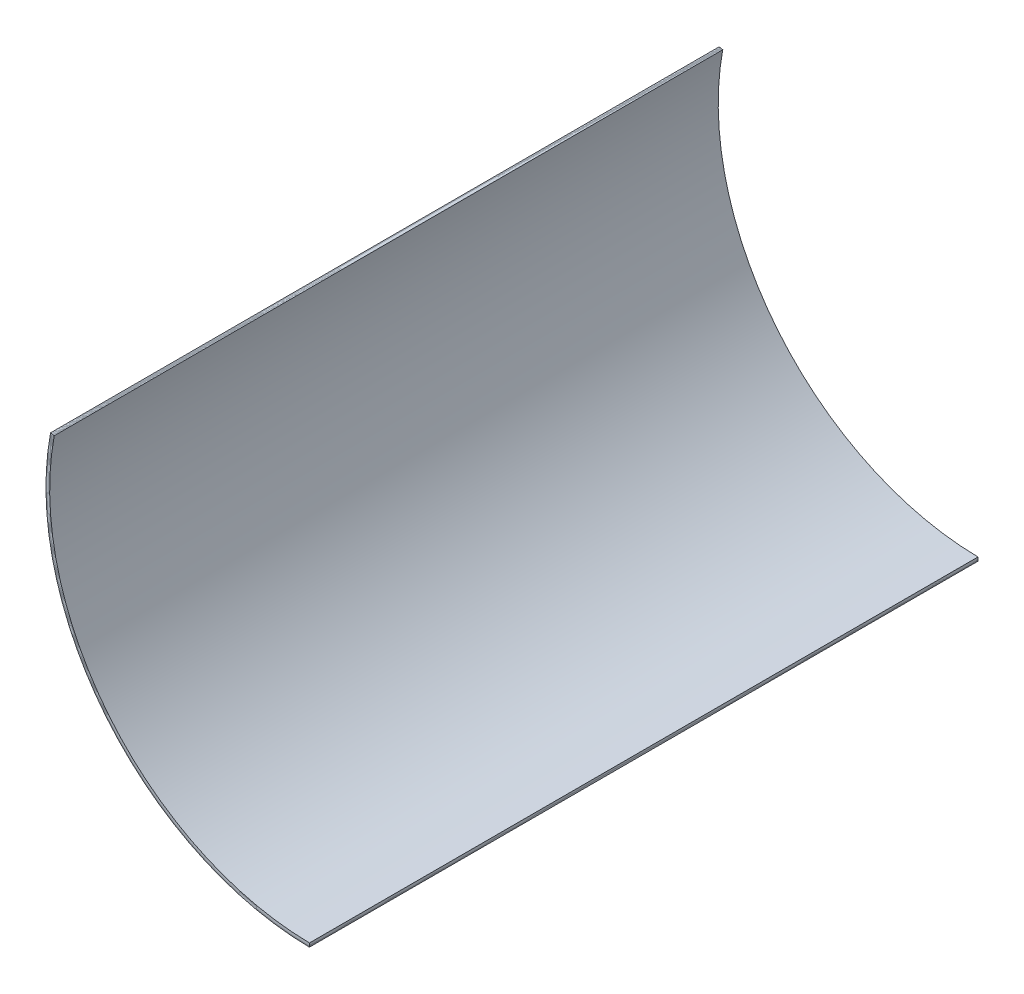
ISO-10303-21;
HEADER;
FILE_DESCRIPTION(('STEP AP214'),'2;1');
FILE_NAME('part.step','',(''),(''),'','','');
FILE_SCHEMA(('AUTOMOTIVE_DESIGN { 1 0 10303 214 1 1 1 1 }'));
ENDSEC;
DATA;
#1=APPLICATION_CONTEXT('core data for automotive mechanical design processes');
#2=APPLICATION_PROTOCOL_DEFINITION('international standard','automotive_design',2000,#1);
#3=PRODUCT_CONTEXT('',#1,'mechanical');
#4=PRODUCT('Part','Part','',(#3));
#5=PRODUCT_RELATED_PRODUCT_CATEGORY('part','',(#4));
#6=PRODUCT_DEFINITION_FORMATION('','',#4);
#7=PRODUCT_DEFINITION_CONTEXT('part definition',#1,'design');
#8=PRODUCT_DEFINITION('design','',#6,#7);
#9=PRODUCT_DEFINITION_SHAPE('','',#8);
#10=(LENGTH_UNIT() NAMED_UNIT(*) SI_UNIT(.MILLI.,.METRE.));
#11=(NAMED_UNIT(*) PLANE_ANGLE_UNIT() SI_UNIT($,.RADIAN.));
#12=(NAMED_UNIT(*) SI_UNIT($,.STERADIAN.) SOLID_ANGLE_UNIT());
#13=UNCERTAINTY_MEASURE_WITH_UNIT(LENGTH_MEASURE(1.E-05),#10,'distance_accuracy_value','');
#14=(GEOMETRIC_REPRESENTATION_CONTEXT(3) GLOBAL_UNCERTAINTY_ASSIGNED_CONTEXT((#13)) GLOBAL_UNIT_ASSIGNED_CONTEXT((#10,
#11,#12)) REPRESENTATION_CONTEXT('',''));
#15=CARTESIAN_POINT('',(0.,0.,0.));
#16=DIRECTION('',(0.,0.,1.));
#17=DIRECTION('',(1.,0.,0.));
#18=AXIS2_PLACEMENT_3D('',#15,#16,#17);
#19=CARTESIAN_POINT('',(0.,0.,607.06));
#20=DIRECTION('',(0.,0.,-1.));
#21=DIRECTION('',(-1.,0.,0.));
#22=AXIS2_PLACEMENT_3D('',#19,#20,#21);
#23=CYLINDRICAL_SURFACE('',#22,239.5728);
#24=CARTESIAN_POINT('',(0.,0.,0.));
#25=DIRECTION('',(0.,0.,1.));
#26=DIRECTION('',(1.,0.,0.));
#27=AXIS2_PLACEMENT_3D('',#24,#25,#26);
#28=CIRCLE('',#27,239.5728);
#29=CARTESIAN_POINT('',(-2.86377940787144,-239.555683020343,0.));
#30=VERTEX_POINT('',#29);
#31=CARTESIAN_POINT('',(-235.419003841152,44.4186799700287,0.));
#32=VERTEX_POINT('',#31);
#33=EDGE_CURVE('E130',#30,#32,#28,.F.);
#34=ORIENTED_EDGE('',*,*,#33,.T.);
#35=DIRECTION('',(0.,0.,-1.));
#36=VECTOR('',#35,1.);
#37=CARTESIAN_POINT('',(-235.419003841152,44.4186799700287,607.06));
#38=LINE('',#37,#36);
#39=CARTESIAN_POINT('',(-235.419003841152,44.4186799700287,607.06));
#40=VERTEX_POINT('',#39);
#41=EDGE_CURVE('E13',#40,#32,#38,.T.);
#42=ORIENTED_EDGE('',*,*,#41,.F.);
#43=CARTESIAN_POINT('',(0.,0.,607.06));
#44=DIRECTION('',(0.,0.,1.));
#45=DIRECTION('',(1.,0.,0.));
#46=AXIS2_PLACEMENT_3D('',#43,#44,#45);
#47=CIRCLE('',#46,239.5728);
#48=CARTESIAN_POINT('',(-2.86377940787144,-239.555683020343,607.06));
#49=VERTEX_POINT('',#48);
#50=EDGE_CURVE('E107',#49,#40,#47,.F.);
#51=ORIENTED_EDGE('',*,*,#50,.F.);
#52=DIRECTION('',(0.,0.,-1.));
#53=VECTOR('',#52,1.);
#54=CARTESIAN_POINT('',(-2.86377940787144,-239.555683020343,607.06));
#55=LINE('',#54,#53);
#56=EDGE_CURVE('E83',#49,#30,#55,.T.);
#57=ORIENTED_EDGE('',*,*,#56,.T.);
#58=EDGE_LOOP('',(#34,#42,#51,#57));
#59=FACE_BOUND('',#58,.T.);
#60=ADVANCED_FACE('F67',(#59),#23,.F.);
#61=CARTESIAN_POINT('',(-237.914964441673,44.8896159323911,607.06));
#62=DIRECTION('',(0.185407859197813,0.982661653748473,0.));
#63=DIRECTION('',(-0.982661653748473,0.185407859197813,0.));
#64=AXIS2_PLACEMENT_3D('',#61,#62,#63);
#65=PLANE('',#64);
#66=DIRECTION('',(0.982661653748473,-0.185407859197813,0.));
#67=VECTOR('',#66,1.);
#68=CARTESIAN_POINT('',(-237.914964441673,44.8896159323911,0.));
#69=LINE('',#68,#67);
#70=CARTESIAN_POINT('',(-237.914964441673,44.8896159323911,0.));
#71=VERTEX_POINT('',#70);
#72=EDGE_CURVE('E116',#71,#32,#69,.T.);
#73=ORIENTED_EDGE('',*,*,#72,.F.);
#74=DIRECTION('',(0.,0.,-1.));
#75=VECTOR('',#74,1.);
#76=CARTESIAN_POINT('',(-237.914964441673,44.8896159323911,607.06));
#77=LINE('',#76,#75);
#78=CARTESIAN_POINT('',(-237.914964441673,44.8896159323911,607.06));
#79=VERTEX_POINT('',#78);
#80=EDGE_CURVE('E75',#79,#71,#77,.T.);
#81=ORIENTED_EDGE('',*,*,#80,.F.);
#82=DIRECTION('',(0.982661653748473,-0.185407859197813,0.));
#83=VECTOR('',#82,1.);
#84=CARTESIAN_POINT('',(-237.914964441673,44.8896159323911,607.06));
#85=LINE('',#84,#83);
#86=EDGE_CURVE('E114',#79,#40,#85,.T.);
#87=ORIENTED_EDGE('',*,*,#86,.T.);
#88=ORIENTED_EDGE('',*,*,#41,.T.);
#89=EDGE_LOOP('',(#73,#81,#87,#88));
#90=FACE_BOUND('',#89,.T.);
#91=ADVANCED_FACE('F113',(#90),#65,.T.);
#92=CARTESIAN_POINT('',(0.,0.,607.06));
#93=DIRECTION('',(0.,0.,-1.));
#94=DIRECTION('',(-1.,0.,0.));
#95=AXIS2_PLACEMENT_3D('',#92,#93,#94);
#96=CYLINDRICAL_SURFACE('',#95,242.1128);
#97=CARTESIAN_POINT('',(0.,0.,0.));
#98=DIRECTION('',(0.,0.,-1.));
#99=DIRECTION('',(-1.,0.,0.));
#100=AXIS2_PLACEMENT_3D('',#97,#98,#99);
#101=CIRCLE('',#100,242.1128);
#102=CARTESIAN_POINT('',(-2.89414178496923,-242.095501542611,0.));
#103=VERTEX_POINT('',#102);
#104=EDGE_CURVE('E133',#103,#71,#101,.T.);
#105=ORIENTED_EDGE('',*,*,#104,.F.);
#106=DIRECTION('',(0.,0.,-1.));
#107=VECTOR('',#106,1.);
#108=CARTESIAN_POINT('',(-2.89414178496923,-242.095501542611,607.06));
#109=LINE('',#108,#107);
#110=CARTESIAN_POINT('',(-2.89414178496923,-242.095501542611,607.06));
#111=VERTEX_POINT('',#110);
#112=EDGE_CURVE('E96',#111,#103,#109,.T.);
#113=ORIENTED_EDGE('',*,*,#112,.F.);
#114=CARTESIAN_POINT('',(0.,0.,607.06));
#115=DIRECTION('',(0.,0.,-1.));
#116=DIRECTION('',(-1.,0.,0.));
#117=AXIS2_PLACEMENT_3D('',#114,#115,#116);
#118=CIRCLE('',#117,242.1128);
#119=EDGE_CURVE('E122',#111,#79,#118,.T.);
#120=ORIENTED_EDGE('',*,*,#119,.T.);
#121=ORIENTED_EDGE('',*,*,#80,.T.);
#122=EDGE_LOOP('',(#105,#113,#120,#121));
#123=FACE_BOUND('',#122,.T.);
#124=ADVANCED_FACE('F124',(#123),#96,.T.);
#125=CARTESIAN_POINT('',(-2.86377940787144,-239.555683020343,607.06));
#126=DIRECTION('',(0.999928552074122,-0.0119536917707813,0.));
#127=DIRECTION('',(0.0119536917707813,0.999928552074121,0.));
#128=AXIS2_PLACEMENT_3D('',#125,#126,#127);
#129=PLANE('',#128);
#130=DIRECTION('',(-0.0119536917707813,-0.999928552074121,0.));
#131=VECTOR('',#130,1.);
#132=CARTESIAN_POINT('',(-2.86377940787144,-239.555683020343,0.));
#133=LINE('',#132,#131);
#134=EDGE_CURVE('E135',#30,#103,#133,.T.);
#135=ORIENTED_EDGE('',*,*,#134,.F.);
#136=ORIENTED_EDGE('',*,*,#56,.F.);
#137=DIRECTION('',(-0.0119536917707813,-0.999928552074121,0.));
#138=VECTOR('',#137,1.);
#139=CARTESIAN_POINT('',(-2.86377940787144,-239.555683020343,607.06));
#140=LINE('',#139,#138);
#141=EDGE_CURVE('E125',#49,#111,#140,.T.);
#142=ORIENTED_EDGE('',*,*,#141,.T.);
#143=ORIENTED_EDGE('',*,*,#112,.T.);
#144=EDGE_LOOP('',(#135,#136,#142,#143));
#145=FACE_BOUND('',#144,.T.);
#146=ADVANCED_FACE('F141',(#145),#129,.T.);
#147=CARTESIAN_POINT('',(0.,0.,607.06));
#148=DIRECTION('',(0.,0.,1.));
#149=DIRECTION('',(1.,0.,0.));
#150=AXIS2_PLACEMENT_3D('',#147,#148,#149);
#151=PLANE('',#150);
#152=ORIENTED_EDGE('',*,*,#50,.T.);
#153=ORIENTED_EDGE('',*,*,#86,.F.);
#154=ORIENTED_EDGE('',*,*,#119,.F.);
#155=ORIENTED_EDGE('',*,*,#141,.F.);
#156=EDGE_LOOP('',(#152,#153,#154,#155));
#157=FACE_BOUND('',#156,.T.);
#158=ADVANCED_FACE('F121',(#157),#151,.T.);
#159=CARTESIAN_POINT('',(0.,0.,0.));
#160=DIRECTION('',(0.,0.,1.));
#161=DIRECTION('',(1.,0.,0.));
#162=AXIS2_PLACEMENT_3D('',#159,#160,#161);
#163=PLANE('',#162);
#164=ORIENTED_EDGE('',*,*,#33,.F.);
#165=ORIENTED_EDGE('',*,*,#134,.T.);
#166=ORIENTED_EDGE('',*,*,#104,.T.);
#167=ORIENTED_EDGE('',*,*,#72,.T.);
#168=EDGE_LOOP('',(#164,#165,#166,#167));
#169=FACE_BOUND('',#168,.T.);
#170=ADVANCED_FACE('F140',(#169),#163,.F.);
#171=CLOSED_SHELL('',(#60,#91,#124,#146,#158,#170));
#172=MANIFOLD_SOLID_BREP('B2',#171);
#173=CARTESIAN_POINT('',(0.,0.,607.06));
#174=DIRECTION('',(0.,0.,-1.));
#175=DIRECTION('',(-1.,0.,0.));
#176=AXIS2_PLACEMENT_3D('',#173,#174,#175);
#177=CYLINDRICAL_SURFACE('',#176,238.76);
#178=CARTESIAN_POINT('',(0.,0.,0.));
#179=DIRECTION('',(0.,0.,1.));
#180=DIRECTION('',(1.,0.,0.));
#181=AXIS2_PLACEMENT_3D('',#178,#179,#180);
#182=CIRCLE('',#181,238.76);
#183=CARTESIAN_POINT('',(-2.85406344720012,-238.742941093217,0.));
#184=VERTEX_POINT('',#183);
#185=CARTESIAN_POINT('',(-234.620296448985,44.2679804620727,0.));
#186=VERTEX_POINT('',#185);
#187=EDGE_CURVE('E254',#184,#186,#182,.F.);
#188=ORIENTED_EDGE('',*,*,#187,.T.);
#189=DIRECTION('',(0.,0.,-1.));
#190=VECTOR('',#189,1.);
#191=CARTESIAN_POINT('',(-234.620296448985,44.2679804620727,607.06));
#192=LINE('',#191,#190);
#193=CARTESIAN_POINT('',(-234.620296448985,44.2679804620727,607.06));
#194=VERTEX_POINT('',#193);
#195=EDGE_CURVE('E65',#194,#186,#192,.T.);
#196=ORIENTED_EDGE('',*,*,#195,.F.);
#197=CARTESIAN_POINT('',(0.,0.,607.06));
#198=DIRECTION('',(0.,0.,1.));
#199=DIRECTION('',(1.,0.,0.));
#200=AXIS2_PLACEMENT_3D('',#197,#198,#199);
#201=CIRCLE('',#200,238.76);
#202=CARTESIAN_POINT('',(-2.85406344720012,-238.742941093217,607.06));
#203=VERTEX_POINT('',#202);
#204=EDGE_CURVE('E231',#203,#194,#201,.F.);
#205=ORIENTED_EDGE('',*,*,#204,.F.);
#206=DIRECTION('',(0.,0.,-1.));
#207=VECTOR('',#206,1.);
#208=CARTESIAN_POINT('',(-2.85406344720012,-238.742941093217,607.06));
#209=LINE('',#208,#207);
#210=EDGE_CURVE('E207',#203,#184,#209,.T.);
#211=ORIENTED_EDGE('',*,*,#210,.T.);
#212=EDGE_LOOP('',(#188,#196,#205,#211));
#213=FACE_BOUND('',#212,.T.);
#214=ADVANCED_FACE('F191',(#213),#177,.F.);
#215=CARTESIAN_POINT('',(-237.116257049506,44.7389164244351,607.06));
#216=DIRECTION('',(0.185407859197815,0.982661653748473,0.));
#217=DIRECTION('',(-0.982661653748473,0.185407859197815,0.));
#218=AXIS2_PLACEMENT_3D('',#215,#216,#217);
#219=PLANE('',#218);
#220=DIRECTION('',(0.982661653748473,-0.185407859197815,0.));
#221=VECTOR('',#220,1.);
#222=CARTESIAN_POINT('',(-237.116257049506,44.7389164244351,0.));
#223=LINE('',#222,#221);
#224=CARTESIAN_POINT('',(-237.116257049506,44.7389164244351,0.));
#225=VERTEX_POINT('',#224);
#226=EDGE_CURVE('E240',#225,#186,#223,.T.);
#227=ORIENTED_EDGE('',*,*,#226,.F.);
#228=DIRECTION('',(0.,0.,-1.));
#229=VECTOR('',#228,1.);
#230=CARTESIAN_POINT('',(-237.116257049506,44.7389164244351,607.06));
#231=LINE('',#230,#229);
#232=CARTESIAN_POINT('',(-237.116257049506,44.7389164244351,607.06));
#233=VERTEX_POINT('',#232);
#234=EDGE_CURVE('E199',#233,#225,#231,.T.);
#235=ORIENTED_EDGE('',*,*,#234,.F.);
#236=DIRECTION('',(0.982661653748473,-0.185407859197815,0.));
#237=VECTOR('',#236,1.);
#238=CARTESIAN_POINT('',(-237.116257049506,44.7389164244351,607.06));
#239=LINE('',#238,#237);
#240=EDGE_CURVE('E238',#233,#194,#239,.T.);
#241=ORIENTED_EDGE('',*,*,#240,.T.);
#242=ORIENTED_EDGE('',*,*,#195,.T.);
#243=EDGE_LOOP('',(#227,#235,#241,#242));
#244=FACE_BOUND('',#243,.T.);
#245=ADVANCED_FACE('F237',(#244),#219,.T.);
#246=CARTESIAN_POINT('',(0.,0.,607.06));
#247=DIRECTION('',(0.,0.,-1.));
#248=DIRECTION('',(-1.,0.,0.));
#249=AXIS2_PLACEMENT_3D('',#246,#247,#248);
#250=CYLINDRICAL_SURFACE('',#249,241.3);
#251=CARTESIAN_POINT('',(0.,0.,0.));
#252=DIRECTION('',(0.,0.,-1.));
#253=DIRECTION('',(-1.,0.,0.));
#254=AXIS2_PLACEMENT_3D('',#251,#252,#253);
#255=CIRCLE('',#254,241.3);
#256=CARTESIAN_POINT('',(-2.88442582429791,-241.282759615485,0.));
#257=VERTEX_POINT('',#256);
#258=EDGE_CURVE('E257',#257,#225,#255,.T.);
#259=ORIENTED_EDGE('',*,*,#258,.F.);
#260=DIRECTION('',(0.,0.,-1.));
#261=VECTOR('',#260,1.);
#262=CARTESIAN_POINT('',(-2.88442582429791,-241.282759615485,607.06));
#263=LINE('',#262,#261);
#264=CARTESIAN_POINT('',(-2.88442582429791,-241.282759615485,607.06));
#265=VERTEX_POINT('',#264);
#266=EDGE_CURVE('E220',#265,#257,#263,.T.);
#267=ORIENTED_EDGE('',*,*,#266,.F.);
#268=CARTESIAN_POINT('',(0.,0.,607.06));
#269=DIRECTION('',(0.,0.,-1.));
#270=DIRECTION('',(-1.,0.,0.));
#271=AXIS2_PLACEMENT_3D('',#268,#269,#270);
#272=CIRCLE('',#271,241.3);
#273=EDGE_CURVE('E246',#265,#233,#272,.T.);
#274=ORIENTED_EDGE('',*,*,#273,.T.);
#275=ORIENTED_EDGE('',*,*,#234,.T.);
#276=EDGE_LOOP('',(#259,#267,#274,#275));
#277=FACE_BOUND('',#276,.T.);
#278=ADVANCED_FACE('F248',(#277),#250,.T.);
#279=CARTESIAN_POINT('',(-2.85406344720012,-238.742941093217,607.06));
#280=DIRECTION('',(0.999928552074122,-0.0119536917707815,0.));
#281=DIRECTION('',(0.0119536917707815,0.999928552074121,0.));
#282=AXIS2_PLACEMENT_3D('',#279,#280,#281);
#283=PLANE('',#282);
#284=DIRECTION('',(-0.0119536917707815,-0.999928552074121,0.));
#285=VECTOR('',#284,1.);
#286=CARTESIAN_POINT('',(-2.85406344720012,-238.742941093217,0.));
#287=LINE('',#286,#285);
#288=EDGE_CURVE('E259',#184,#257,#287,.T.);
#289=ORIENTED_EDGE('',*,*,#288,.F.);
#290=ORIENTED_EDGE('',*,*,#210,.F.);
#291=DIRECTION('',(-0.0119536917707815,-0.999928552074121,0.));
#292=VECTOR('',#291,1.);
#293=CARTESIAN_POINT('',(-2.85406344720012,-238.742941093217,607.06));
#294=LINE('',#293,#292);
#295=EDGE_CURVE('E249',#203,#265,#294,.T.);
#296=ORIENTED_EDGE('',*,*,#295,.T.);
#297=ORIENTED_EDGE('',*,*,#266,.T.);
#298=EDGE_LOOP('',(#289,#290,#296,#297));
#299=FACE_BOUND('',#298,.T.);
#300=ADVANCED_FACE('F265',(#299),#283,.T.);
#301=CARTESIAN_POINT('',(0.,0.,607.06));
#302=DIRECTION('',(0.,0.,1.));
#303=DIRECTION('',(1.,0.,0.));
#304=AXIS2_PLACEMENT_3D('',#301,#302,#303);
#305=PLANE('',#304);
#306=ORIENTED_EDGE('',*,*,#204,.T.);
#307=ORIENTED_EDGE('',*,*,#240,.F.);
#308=ORIENTED_EDGE('',*,*,#273,.F.);
#309=ORIENTED_EDGE('',*,*,#295,.F.);
#310=EDGE_LOOP('',(#306,#307,#308,#309));
#311=FACE_BOUND('',#310,.T.);
#312=ADVANCED_FACE('F245',(#311),#305,.T.);
#313=CARTESIAN_POINT('',(0.,0.,0.));
#314=DIRECTION('',(0.,0.,1.));
#315=DIRECTION('',(1.,0.,0.));
#316=AXIS2_PLACEMENT_3D('',#313,#314,#315);
#317=PLANE('',#316);
#318=ORIENTED_EDGE('',*,*,#187,.F.);
#319=ORIENTED_EDGE('',*,*,#288,.T.);
#320=ORIENTED_EDGE('',*,*,#258,.T.);
#321=ORIENTED_EDGE('',*,*,#226,.T.);
#322=EDGE_LOOP('',(#318,#319,#320,#321));
#323=FACE_BOUND('',#322,.T.);
#324=ADVANCED_FACE('F264',(#323),#317,.F.);
#325=CLOSED_SHELL('',(#214,#245,#278,#300,#312,#324));
#326=MANIFOLD_SOLID_BREP('B7',#325);
#327=ADVANCED_BREP_SHAPE_REPRESENTATION('',(#18,#172,#326),#14);
#328=SHAPE_DEFINITION_REPRESENTATION(#9,#327);
ENDSEC;
END-ISO-10303-21;
